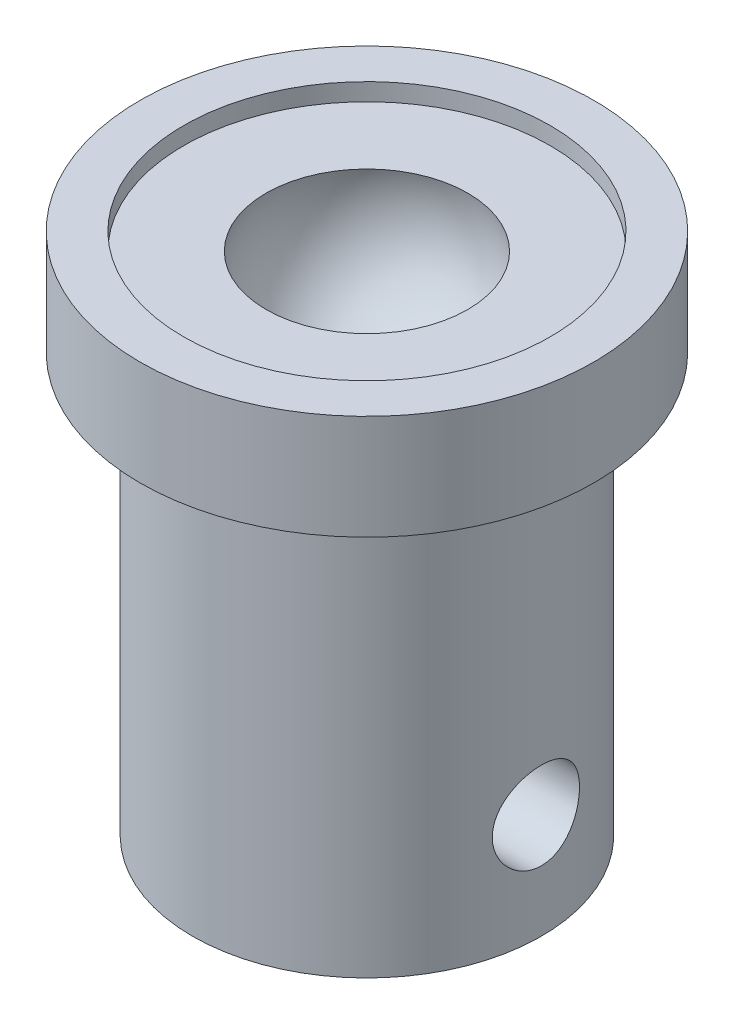
ISO-10303-21;
HEADER;
FILE_DESCRIPTION(('STEP AP214'),'2;1');
FILE_NAME('part.step','',(''),(''),'','','');
FILE_SCHEMA(('AUTOMOTIVE_DESIGN { 1 0 10303 214 1 1 1 1 }'));
ENDSEC;
DATA;
#1=APPLICATION_CONTEXT('core data for automotive mechanical design processes');
#2=APPLICATION_PROTOCOL_DEFINITION('international standard','automotive_design',2000,#1);
#3=PRODUCT_CONTEXT('',#1,'mechanical');
#4=PRODUCT('Part','Part','',(#3));
#5=PRODUCT_RELATED_PRODUCT_CATEGORY('part','',(#4));
#6=PRODUCT_DEFINITION_FORMATION('','',#4);
#7=PRODUCT_DEFINITION_CONTEXT('part definition',#1,'design');
#8=PRODUCT_DEFINITION('design','',#6,#7);
#9=PRODUCT_DEFINITION_SHAPE('','',#8);
#10=(LENGTH_UNIT() NAMED_UNIT(*) SI_UNIT(.MILLI.,.METRE.));
#11=(NAMED_UNIT(*) PLANE_ANGLE_UNIT() SI_UNIT($,.RADIAN.));
#12=(NAMED_UNIT(*) SI_UNIT($,.STERADIAN.) SOLID_ANGLE_UNIT());
#13=UNCERTAINTY_MEASURE_WITH_UNIT(LENGTH_MEASURE(1.E-05),#10,'distance_accuracy_value','');
#14=(GEOMETRIC_REPRESENTATION_CONTEXT(3) GLOBAL_UNCERTAINTY_ASSIGNED_CONTEXT((#13)) GLOBAL_UNIT_ASSIGNED_CONTEXT((#10,
#11,#12)) REPRESENTATION_CONTEXT('',''));
#15=CARTESIAN_POINT('',(0.,0.,0.));
#16=DIRECTION('',(0.,0.,1.));
#17=DIRECTION('',(1.,0.,0.));
#18=AXIS2_PLACEMENT_3D('',#15,#16,#17);
#19=CARTESIAN_POINT('',(-13.,6.,0.));
#20=DIRECTION('',(1.,0.,0.));
#21=DIRECTION('',(0.,0.,-1.));
#22=AXIS2_PLACEMENT_3D('',#19,#20,#21);
#23=CYLINDRICAL_SURFACE('',#22,2.5);
#24=CARTESIAN_POINT('',(-4.5,6.,0.));
#25=DIRECTION('',(-1.,0.,0.));
#26=DIRECTION('',(0.,0.,1.));
#27=AXIS2_PLACEMENT_3D('',#24,#25,#26);
#28=CIRCLE('',#27,2.5);
#29=CARTESIAN_POINT('',(-4.5,6.,2.5));
#30=VERTEX_POINT('',#29);
#31=EDGE_CURVE('E134',#30,#30,#28,.F.);
#32=ORIENTED_EDGE('',*,*,#31,.T.);
#33=EDGE_LOOP('',(#32));
#34=FACE_BOUND('',#33,.T.);
#35=CARTESIAN_POINT('',(-9.68245836551854,6.,-2.5));
#36=CARTESIAN_POINT('',(-9.6824610008786,6.13805075092658,-2.49999607859307));
#37=CARTESIAN_POINT('',(-9.68544306014597,6.27614489867852,-2.48852624549765));
#38=CARTESIAN_POINT('',(-9.69701861992564,6.54836757817351,-2.44302312546379));
#39=CARTESIAN_POINT('',(-9.7056153862163,6.68249375446819,-2.40897670674211));
#40=CARTESIAN_POINT('',(-9.7273872459615,6.94280353818718,-2.31949119963204));
#41=CARTESIAN_POINT('',(-9.74055642690458,7.06899715538571,-2.26407972785449));
#42=CARTESIAN_POINT('',(-9.76998192028759,7.31031085253988,-2.13352114126138));
#43=CARTESIAN_POINT('',(-9.78623836378489,7.42543046208022,-2.05837318856068));
#44=CARTESIAN_POINT('',(-9.82040716355625,7.64386164526222,-1.88870842731188));
#45=CARTESIAN_POINT('',(-9.83834597623034,7.74689360035005,-1.79383688770405));
#46=CARTESIAN_POINT('',(-9.87362875515294,7.93576139436034,-1.58818206410066));
#47=CARTESIAN_POINT('',(-9.89097266566388,8.02159562562175,-1.47739729418031));
#48=CARTESIAN_POINT('',(-9.92340415520583,8.17477546763128,-1.24114520107895));
#49=CARTESIAN_POINT('',(-9.93845687400592,8.24184638816147,-1.11549457619512));
#50=CARTESIAN_POINT('',(-9.96430811925984,8.35380964415308,-0.85426318429276));
#51=CARTESIAN_POINT('',(-9.97510727334345,8.39870525191552,-0.718683885791939));
#52=CARTESIAN_POINT('',(-9.9910475884818,8.46414783457859,-0.44435875875416));
#53=CARTESIAN_POINT('',(-9.99629893844314,8.48516964432658,-0.305732719548974));
#54=CARTESIAN_POINT('',(-10.000935941073,8.50375837927555,-0.026828819262768));
#55=CARTESIAN_POINT('',(-10.000322460967,8.5013287722096,0.11344879453807));
#56=CARTESIAN_POINT('',(-9.99338094953534,8.47342514974986,0.38838061793097));
#57=CARTESIAN_POINT('',(-9.98718002340871,8.44846367494614,0.523090539002669));
#58=CARTESIAN_POINT('',(-9.96990836524857,8.3770287299515,0.786345618534217));
#59=CARTESIAN_POINT('',(-9.95883737398452,8.33055411462259,0.914890448426096));
#60=CARTESIAN_POINT('',(-9.93287509700884,8.21699742931294,1.16351675875452));
#61=CARTESIAN_POINT('',(-9.91795019695011,8.14973295533825,1.28351127441626));
#62=CARTESIAN_POINT('',(-9.88589903809692,7.99664432088374,1.51068905585122));
#63=CARTESIAN_POINT('',(-9.8687723965265,7.91081693143937,1.61787008771377));
#64=CARTESIAN_POINT('',(-9.83363713769356,7.72029125801763,1.81943508771239));
#65=CARTESIAN_POINT('',(-9.81561719525297,7.61514510765225,1.91339419768799));
#66=CARTESIAN_POINT('',(-9.78115043517327,7.39040002645972,2.08244093990755));
#67=CARTESIAN_POINT('',(-9.76470369108289,7.27080042050889,2.15752769011507));
#68=CARTESIAN_POINT('',(-9.73520496829319,7.01970996585114,2.28697032255647));
#69=CARTESIAN_POINT('',(-9.72216983717007,6.88816426968719,2.34122391742613));
#70=CARTESIAN_POINT('',(-9.70118640148669,6.61741453192316,2.42671405159096));
#71=CARTESIAN_POINT('',(-9.69323700842733,6.4782121360154,2.45795551638266));
#72=CARTESIAN_POINT('',(-9.68355356007457,6.20004049847008,2.49582963866592));
#73=CARTESIAN_POINT('',(-9.68166088976933,6.06116220665897,2.50309047391912));
#74=CARTESIAN_POINT('',(-9.68387343364692,5.78417806341474,2.49451699051516));
#75=CARTESIAN_POINT('',(-9.687978095703,5.64607214205056,2.4786847978498));
#76=CARTESIAN_POINT('',(-9.7015708198498,5.37688573505143,2.42492546393825));
#77=CARTESIAN_POINT('',(-9.71096970242532,5.2457272734308,2.3873640682819));
#78=CARTESIAN_POINT('',(-9.73400718262805,4.99156854214667,2.29161808167046));
#79=CARTESIAN_POINT('',(-9.74764628246408,4.86856924094421,2.2334310477125));
#80=CARTESIAN_POINT('',(-9.77796137095511,4.6315587221331,2.0967706679366));
#81=CARTESIAN_POINT('',(-9.79469168607245,4.51777115995702,2.01792175383564));
#82=CARTESIAN_POINT('',(-9.82917083071113,4.30481163719852,1.84265073233613));
#83=CARTESIAN_POINT('',(-9.84691982728307,4.20564208334989,1.74622573701359));
#84=CARTESIAN_POINT('',(-9.88197403031774,4.02218895742908,1.53565680246182));
#85=CARTESIAN_POINT('',(-9.8992570206188,3.9383399374512,1.42112988132898));
#86=CARTESIAN_POINT('',(-9.93097216613689,3.79106413304875,1.17925670673669));
#87=CARTESIAN_POINT('',(-9.94540447003949,3.72763628339179,1.05191112239398));
#88=CARTESIAN_POINT('',(-9.96970115738325,3.62355396547207,0.788895504327724));
#89=CARTESIAN_POINT('',(-9.97959830022409,3.58273571562093,0.653293452569703));
#90=CARTESIAN_POINT('',(-9.99385293395789,3.52453966539158,0.376874400797015));
#91=CARTESIAN_POINT('',(-9.99821149393422,3.50715734126096,0.236058412603099));
#92=CARTESIAN_POINT('',(-10.0008542352202,3.49658102606115,-0.0427088161083106));
#93=CARTESIAN_POINT('',(-9.99929947199971,3.50274572726148,-0.180634567415057));
#94=CARTESIAN_POINT('',(-9.99064741143608,3.53761956823587,-0.45341874103688));
#95=CARTESIAN_POINT('',(-9.98355027892922,3.56632803753292,-0.588277254452324));
#96=CARTESIAN_POINT('',(-9.96463582134723,3.64513054942715,-0.850427589111938));
#97=CARTESIAN_POINT('',(-9.95284411255981,3.69510863328595,-0.977756236452159));
#98=CARTESIAN_POINT('',(-9.92578222284145,3.81492644754893,-1.22229263260406));
#99=CARTESIAN_POINT('',(-9.91051160346894,3.88476868167621,-1.33949910316409));
#100=CARTESIAN_POINT('',(-9.87768124200718,4.04428808499033,-1.56350482105826));
#101=CARTESIAN_POINT('',(-9.86007542354161,4.13440035725958,-1.66998747074584));
#102=CARTESIAN_POINT('',(-9.82476622642974,4.33105712994337,-1.86653755068376));
#103=CARTESIAN_POINT('',(-9.80706282418256,4.43760579027791,-1.95660081269148));
#104=CARTESIAN_POINT('',(-9.77318689613756,4.66650353547365,-2.11940506617958));
#105=CARTESIAN_POINT('',(-9.75704909183222,4.78911030841314,-2.19179154854095));
#106=CARTESIAN_POINT('',(-9.7285988873707,5.04513872468705,-2.31481724146368));
#107=CARTESIAN_POINT('',(-9.71628370583034,5.17855241523462,-2.36547227438038));
#108=CARTESIAN_POINT('',(-9.69879771876843,5.4264425295879,-2.43605632142751));
#109=CARTESIAN_POINT('',(-9.69271657508747,5.53973291096534,-2.4599829264922));
#110=CARTESIAN_POINT('',(-9.6845459645655,5.76867217249422,-2.49195573142942));
#111=CARTESIAN_POINT('',(-9.68245615722769,5.88432085061101,-2.50000328592938));
#112=CARTESIAN_POINT('',(-9.68245836551854,6.,-2.5));
#113=B_SPLINE_CURVE_WITH_KNOTS('',3,(#35,#36,#37,#38,#39,#40,#41,#42,#43,#44,#45,#46,#47,#48,
#49,#50,#51,#52,#53,#54,#55,#56,#57,#58,#59,#60,#61,#62,#63,#64,#65,#66,#67,#68,#69,#70,#71,#72,
#73,#74,#75,#76,#77,#78,#79,#80,#81,#82,#83,#84,#85,#86,#87,#88,#89,#90,#91,#92,#93,#94,#95,#96,
#97,#98,#99,#100,#101,#102,#103,#104,#105,#106,#107,#108,#109,#110,#111,#112),.UNSPECIFIED.,.T.,
.F.,(4,2,2,2,2,2,2,2,2,2,2,2,2,2,2,2,2,2,2,2,2,2,2,2,2,2,2,2,2,2,2,2,2,2,2,2,2,2,4),(0.,
0.413727441736137,0.827695741428667,1.24113072716602,1.65458326755479,2.07623954192976,
2.49793521479867,2.9255149639792,3.35303159847092,3.77188750995347,4.19068148666021,
4.60018262688947,5.00970556724786,5.42292874254445,5.83622385468913,6.26070466571912,
6.68520531199802,7.11176432008403,7.53823200129548,7.95343574764204,8.36860127188747,
8.77697405014152,9.18539521426363,9.60182845864102,10.0183301888999,10.4452533097026,
10.872154157245,11.2959207281187,11.7196054891398,12.131834461324,12.5440511738193,
12.9540487656466,13.3640980574302,13.7839709658702,14.2039503157045,14.6317647729113,
15.0592672137502,15.4059782718573,15.7526597510792),.UNSPECIFIED.);
#114=CARTESIAN_POINT('',(-9.68245836551854,6.,-2.5));
#115=VERTEX_POINT('',#114);
#116=EDGE_CURVE('E125',#115,#115,#113,.T.);
#117=ORIENTED_EDGE('',*,*,#116,.F.);
#118=EDGE_LOOP('',(#117));
#119=FACE_BOUND('',#118,.T.);
#120=ADVANCED_FACE('F35',(#34,#119),#23,.F.);
#121=CARTESIAN_POINT('',(0.,30.,0.));
#122=DIRECTION('',(0.,-1.,0.));
#123=DIRECTION('',(0.,0.,-1.));
#124=AXIS2_PLACEMENT_3D('',#121,#122,#123);
#125=CYLINDRICAL_SURFACE('',#124,10.);
#126=ORIENTED_EDGE('',*,*,#116,.T.);
#127=EDGE_LOOP('',(#126));
#128=FACE_BOUND('',#127,.T.);
#129=CARTESIAN_POINT('',(9.68245836551854,6.,-2.5));
#130=CARTESIAN_POINT('',(9.6824610008786,5.86194924907342,-2.49999607859307));
#131=CARTESIAN_POINT('',(9.68544306014597,5.72385510132148,-2.48852624549765));
#132=CARTESIAN_POINT('',(9.69701861992564,5.45163242182649,-2.44302312546379));
#133=CARTESIAN_POINT('',(9.7056153862163,5.31750624553181,-2.40897670674211));
#134=CARTESIAN_POINT('',(9.7273872459615,5.05719646181282,-2.31949119963204));
#135=CARTESIAN_POINT('',(9.74055642690458,4.93100284461429,-2.26407972785449));
#136=CARTESIAN_POINT('',(9.76998192028759,4.68968914746012,-2.13352114126138));
#137=CARTESIAN_POINT('',(9.78623836378489,4.57456953791978,-2.05837318856068));
#138=CARTESIAN_POINT('',(9.82040716355625,4.35613835473778,-1.88870842731188));
#139=CARTESIAN_POINT('',(9.83834597623034,4.25310639964995,-1.79383688770405));
#140=CARTESIAN_POINT('',(9.87362875515294,4.06423860563966,-1.58818206410066));
#141=CARTESIAN_POINT('',(9.89097266566388,3.97840437437825,-1.47739729418031));
#142=CARTESIAN_POINT('',(9.92340415520582,3.82522453236872,-1.24114520107895));
#143=CARTESIAN_POINT('',(9.93845687400592,3.75815361183853,-1.11549457619512));
#144=CARTESIAN_POINT('',(9.96430811925984,3.64619035584692,-0.854263184292761));
#145=CARTESIAN_POINT('',(9.97510727334345,3.60129474808448,-0.718683885791939));
#146=CARTESIAN_POINT('',(9.9910475884818,3.53585216542141,-0.44435875875416));
#147=CARTESIAN_POINT('',(9.99629893844314,3.51483035567342,-0.305732719548974));
#148=CARTESIAN_POINT('',(10.000935941073,3.49624162072445,-0.026828819262768));
#149=CARTESIAN_POINT('',(10.000322460967,3.4986712277904,0.11344879453807));
#150=CARTESIAN_POINT('',(9.99338094953534,3.52657485025014,0.388380617930969));
#151=CARTESIAN_POINT('',(9.98718002340871,3.55153632505386,0.523090539002669));
#152=CARTESIAN_POINT('',(9.96990836524857,3.6229712700485,0.786345618534217));
#153=CARTESIAN_POINT('',(9.95883737398452,3.66944588537741,0.914890448426096));
#154=CARTESIAN_POINT('',(9.93287509700884,3.78300257068706,1.16351675875452));
#155=CARTESIAN_POINT('',(9.91795019695011,3.85026704466174,1.28351127441626));
#156=CARTESIAN_POINT('',(9.88589903809692,4.00335567911626,1.51068905585122));
#157=CARTESIAN_POINT('',(9.8687723965265,4.08918306856063,1.61787008771377));
#158=CARTESIAN_POINT('',(9.83363713769356,4.27970874198237,1.81943508771239));
#159=CARTESIAN_POINT('',(9.81561719525297,4.38485489234775,1.91339419768799));
#160=CARTESIAN_POINT('',(9.78115043517327,4.60959997354028,2.08244093990755));
#161=CARTESIAN_POINT('',(9.76470369108289,4.72919957949111,2.15752769011507));
#162=CARTESIAN_POINT('',(9.73520496829319,4.98029003414886,2.28697032255647));
#163=CARTESIAN_POINT('',(9.72216983717007,5.1118357303128,2.34122391742613));
#164=CARTESIAN_POINT('',(9.70118640148669,5.38258546807684,2.42671405159095));
#165=CARTESIAN_POINT('',(9.69323700842733,5.5217878639846,2.45795551638266));
#166=CARTESIAN_POINT('',(9.68355356007457,5.79995950152992,2.49582963866592));
#167=CARTESIAN_POINT('',(9.68166088976933,5.93883779334103,2.50309047391912));
#168=CARTESIAN_POINT('',(9.68387343364692,6.21582193658526,2.49451699051516));
#169=CARTESIAN_POINT('',(9.687978095703,6.35392785794944,2.4786847978498));
#170=CARTESIAN_POINT('',(9.70157081984979,6.62311426494857,2.42492546393825));
#171=CARTESIAN_POINT('',(9.71096970242531,6.7542727265692,2.3873640682819));
#172=CARTESIAN_POINT('',(9.73400718262805,7.00843145785333,2.29161808167046));
#173=CARTESIAN_POINT('',(9.74764628246408,7.13143075905578,2.2334310477125));
#174=CARTESIAN_POINT('',(9.77796137095511,7.3684412778669,2.0967706679366));
#175=CARTESIAN_POINT('',(9.79469168607245,7.48222884004298,2.01792175383564));
#176=CARTESIAN_POINT('',(9.82917083071113,7.69518836280148,1.84265073233613));
#177=CARTESIAN_POINT('',(9.84691982728307,7.79435791665011,1.7462257370136));
#178=CARTESIAN_POINT('',(9.88197403031774,7.97781104257092,1.53565680246182));
#179=CARTESIAN_POINT('',(9.8992570206188,8.06166006254881,1.42112988132898));
#180=CARTESIAN_POINT('',(9.93097216613689,8.20893586695125,1.17925670673669));
#181=CARTESIAN_POINT('',(9.94540447003949,8.27236371660821,1.05191112239398));
#182=CARTESIAN_POINT('',(9.96970115738325,8.37644603452793,0.788895504327727));
#183=CARTESIAN_POINT('',(9.97959830022409,8.41726428437907,0.653293452569706));
#184=CARTESIAN_POINT('',(9.99385293395789,8.47546033460842,0.376874400797018));
#185=CARTESIAN_POINT('',(9.99821149393422,8.49284265873904,0.236058412603101));
#186=CARTESIAN_POINT('',(10.0008542352202,8.50341897393885,-0.0427088161083087));
#187=CARTESIAN_POINT('',(9.99929947199971,8.49725427273852,-0.180634567415055));
#188=CARTESIAN_POINT('',(9.99064741143608,8.46238043176413,-0.453418741036878));
#189=CARTESIAN_POINT('',(9.98355027892922,8.43367196246708,-0.588277254452323));
#190=CARTESIAN_POINT('',(9.96463582134723,8.35486945057285,-0.850427589111936));
#191=CARTESIAN_POINT('',(9.95284411255981,8.30489136671405,-0.977756236452157));
#192=CARTESIAN_POINT('',(9.92578222284145,8.18507355245107,-1.22229263260406));
#193=CARTESIAN_POINT('',(9.91051160346894,8.11523131832379,-1.33949910316408));
#194=CARTESIAN_POINT('',(9.87768124200718,7.95571191500967,-1.56350482105826));
#195=CARTESIAN_POINT('',(9.86007542354161,7.86559964274043,-1.66998747074584));
#196=CARTESIAN_POINT('',(9.82476622642974,7.66894287005663,-1.86653755068376));
#197=CARTESIAN_POINT('',(9.80706282418256,7.56239420972209,-1.95660081269148));
#198=CARTESIAN_POINT('',(9.77318689613756,7.33349646452635,-2.11940506617958));
#199=CARTESIAN_POINT('',(9.75704909183222,7.21088969158687,-2.19179154854095));
#200=CARTESIAN_POINT('',(9.7285988873707,6.95486127531295,-2.31481724146367));
#201=CARTESIAN_POINT('',(9.71628370583034,6.82144758476538,-2.36547227438038));
#202=CARTESIAN_POINT('',(9.69879771876843,6.5735574704121,-2.43605632142751));
#203=CARTESIAN_POINT('',(9.69271657508747,6.46026708903466,-2.4599829264922));
#204=CARTESIAN_POINT('',(9.6845459645655,6.23132782750578,-2.49195573142942));
#205=CARTESIAN_POINT('',(9.68245615722769,6.11567914938899,-2.50000328592938));
#206=CARTESIAN_POINT('',(9.68245836551854,6.,-2.5));
#207=B_SPLINE_CURVE_WITH_KNOTS('',3,(#129,#130,#131,#132,#133,#134,#135,#136,#137,#138,#139,
#140,#141,#142,#143,#144,#145,#146,#147,#148,#149,#150,#151,#152,#153,#154,#155,#156,#157,#158,
#159,#160,#161,#162,#163,#164,#165,#166,#167,#168,#169,#170,#171,#172,#173,#174,#175,#176,#177,
#178,#179,#180,#181,#182,#183,#184,#185,#186,#187,#188,#189,#190,#191,#192,#193,#194,#195,#196,
#197,#198,#199,#200,#201,#202,#203,#204,#205,#206),.UNSPECIFIED.,.T.,.F.,(4,2,2,2,2,2,2,2,2,2,2,
2,2,2,2,2,2,2,2,2,2,2,2,2,2,2,2,2,2,2,2,2,2,2,2,2,2,2,4),(0.,0.413727441736137,
0.827695741428667,1.24113072716602,1.65458326755479,2.07623954192976,2.49793521479867,
2.9255149639792,3.35303159847093,3.77188750995347,4.19068148666021,4.60018262688947,
5.00970556724786,5.42292874254445,5.83622385468914,6.26070466571912,6.68520531199802,
7.11176432008403,7.53823200129548,7.95343574764205,8.36860127188747,8.77697405014152,
9.18539521426363,9.60182845864103,10.0183301888999,10.4452533097026,10.872154157245,
11.2959207281187,11.7196054891398,12.131834461324,12.5440511738193,12.9540487656466,
13.3640980574302,13.7839709658702,14.2039503157045,14.6317647729113,15.0592672137501,
15.4059782718573,15.7526597510792),.UNSPECIFIED.);
#208=CARTESIAN_POINT('',(9.68245836551854,6.,-2.5));
#209=VERTEX_POINT('',#208);
#210=EDGE_CURVE('E128',#209,#209,#207,.T.);
#211=ORIENTED_EDGE('',*,*,#210,.T.);
#212=EDGE_LOOP('',(#211));
#213=FACE_BOUND('',#212,.T.);
#214=CARTESIAN_POINT('',(0.,0.,0.));
#215=DIRECTION('',(0.,1.,0.));
#216=DIRECTION('',(0.,0.,1.));
#217=AXIS2_PLACEMENT_3D('',#214,#215,#216);
#218=CIRCLE('',#217,10.);
#219=CARTESIAN_POINT('',(0.,0.,10.));
#220=VERTEX_POINT('',#219);
#221=EDGE_CURVE('E45',#220,#220,#218,.T.);
#222=ORIENTED_EDGE('',*,*,#221,.T.);
#223=EDGE_LOOP('',(#222));
#224=FACE_BOUND('',#223,.T.);
#225=CARTESIAN_POINT('',(0.,24.,0.));
#226=DIRECTION('',(0.,1.,0.));
#227=DIRECTION('',(0.,0.,1.));
#228=AXIS2_PLACEMENT_3D('',#225,#226,#227);
#229=CIRCLE('',#228,10.);
#230=CARTESIAN_POINT('',(0.,24.,10.));
#231=VERTEX_POINT('',#230);
#232=EDGE_CURVE('E11',#231,#231,#229,.T.);
#233=ORIENTED_EDGE('',*,*,#232,.F.);
#234=EDGE_LOOP('',(#233));
#235=FACE_BOUND('',#234,.T.);
#236=ADVANCED_FACE('F37',(#128,#213,#224,#235),#125,.T.);
#237=CARTESIAN_POINT('',(0.,0.,0.));
#238=DIRECTION('',(0.,1.,0.));
#239=DIRECTION('',(0.,0.,1.));
#240=AXIS2_PLACEMENT_3D('',#237,#238,#239);
#241=PLANE('',#240);
#242=DIRECTION('',(1.,0.,0.));
#243=VECTOR('',#242,1.);
#244=CARTESIAN_POINT('',(4.5,0.,-4.5));
#245=LINE('',#244,#243);
#246=CARTESIAN_POINT('',(-4.5,0.,-4.5));
#247=VERTEX_POINT('',#246);
#248=CARTESIAN_POINT('',(4.5,0.,-4.5));
#249=VERTEX_POINT('',#248);
#250=EDGE_CURVE('E88',#247,#249,#245,.T.);
#251=ORIENTED_EDGE('',*,*,#250,.F.);
#252=DIRECTION('',(0.,0.,-1.));
#253=VECTOR('',#252,1.);
#254=CARTESIAN_POINT('',(-4.5,0.,4.5));
#255=LINE('',#254,#253);
#256=CARTESIAN_POINT('',(-4.5,0.,4.5));
#257=VERTEX_POINT('',#256);
#258=EDGE_CURVE('E53',#257,#247,#255,.T.);
#259=ORIENTED_EDGE('',*,*,#258,.F.);
#260=DIRECTION('',(-1.,0.,0.));
#261=VECTOR('',#260,1.);
#262=CARTESIAN_POINT('',(4.5,0.,4.5));
#263=LINE('',#262,#261);
#264=CARTESIAN_POINT('',(4.5,0.,4.5));
#265=VERTEX_POINT('',#264);
#266=EDGE_CURVE('E105',#265,#257,#263,.T.);
#267=ORIENTED_EDGE('',*,*,#266,.F.);
#268=DIRECTION('',(0.,0.,1.));
#269=VECTOR('',#268,1.);
#270=CARTESIAN_POINT('',(4.5,0.,4.5));
#271=LINE('',#270,#269);
#272=EDGE_CURVE('E112',#249,#265,#271,.T.);
#273=ORIENTED_EDGE('',*,*,#272,.F.);
#274=EDGE_LOOP('',(#251,#259,#267,#273));
#275=FACE_BOUND('',#274,.T.);
#276=ORIENTED_EDGE('',*,*,#221,.F.);
#277=EDGE_LOOP('',(#276));
#278=FACE_BOUND('',#277,.T.);
#279=ADVANCED_FACE('F155',(#275,#278),#241,.F.);
#280=CARTESIAN_POINT('',(0.,24.,0.));
#281=DIRECTION('',(0.,1.,0.));
#282=DIRECTION('',(0.,0.,1.));
#283=AXIS2_PLACEMENT_3D('',#280,#281,#282);
#284=CYLINDRICAL_SURFACE('',#283,13.);
#285=CARTESIAN_POINT('',(0.,24.,0.));
#286=DIRECTION('',(0.,1.,0.));
#287=DIRECTION('',(0.,0.,1.));
#288=AXIS2_PLACEMENT_3D('',#285,#286,#287);
#289=CIRCLE('',#288,13.);
#290=CARTESIAN_POINT('',(0.,24.,13.));
#291=VERTEX_POINT('',#290);
#292=EDGE_CURVE('E119',#291,#291,#289,.T.);
#293=ORIENTED_EDGE('',*,*,#292,.T.);
#294=EDGE_LOOP('',(#293));
#295=FACE_BOUND('',#294,.T.);
#296=CARTESIAN_POINT('',(0.,30.,0.));
#297=DIRECTION('',(0.,1.,0.));
#298=DIRECTION('',(0.,0.,1.));
#299=AXIS2_PLACEMENT_3D('',#296,#297,#298);
#300=CIRCLE('',#299,13.);
#301=CARTESIAN_POINT('',(0.,30.,13.));
#302=VERTEX_POINT('',#301);
#303=EDGE_CURVE('E122',#302,#302,#300,.T.);
#304=ORIENTED_EDGE('',*,*,#303,.F.);
#305=EDGE_LOOP('',(#304));
#306=FACE_BOUND('',#305,.T.);
#307=ADVANCED_FACE('F151',(#295,#306),#284,.T.);
#308=CARTESIAN_POINT('',(0.,24.,0.));
#309=DIRECTION('',(0.,1.,0.));
#310=DIRECTION('',(0.,0.,1.));
#311=AXIS2_PLACEMENT_3D('',#308,#309,#310);
#312=PLANE('',#311);
#313=ORIENTED_EDGE('',*,*,#232,.T.);
#314=EDGE_LOOP('',(#313));
#315=FACE_BOUND('',#314,.T.);
#316=ORIENTED_EDGE('',*,*,#292,.F.);
#317=EDGE_LOOP('',(#316));
#318=FACE_BOUND('',#317,.T.);
#319=ADVANCED_FACE('F147',(#315,#318),#312,.F.);
#320=CARTESIAN_POINT('',(0.,30.,0.));
#321=DIRECTION('',(0.,1.,0.));
#322=DIRECTION('',(0.,0.,1.));
#323=AXIS2_PLACEMENT_3D('',#320,#321,#322);
#324=PLANE('',#323);
#325=CARTESIAN_POINT('',(0.,30.,0.));
#326=DIRECTION('',(0.,1.,0.));
#327=DIRECTION('',(0.,0.,1.));
#328=AXIS2_PLACEMENT_3D('',#325,#326,#327);
#329=CIRCLE('',#328,10.5);
#330=CARTESIAN_POINT('',(0.,30.,10.5));
#331=VERTEX_POINT('',#330);
#332=EDGE_CURVE('E225',#331,#331,#329,.T.);
#333=ORIENTED_EDGE('',*,*,#332,.F.);
#334=EDGE_LOOP('',(#333));
#335=FACE_BOUND('',#334,.T.);
#336=ORIENTED_EDGE('',*,*,#303,.T.);
#337=EDGE_LOOP('',(#336));
#338=FACE_BOUND('',#337,.T.);
#339=ADVANCED_FACE('F144',(#335,#338),#324,.T.);
#340=CARTESIAN_POINT('',(4.5,6.,0.));
#341=DIRECTION('',(1.,0.,0.));
#342=DIRECTION('',(0.,0.,-1.));
#343=AXIS2_PLACEMENT_3D('',#340,#341,#342);
#344=CIRCLE('',#343,2.5);
#345=CARTESIAN_POINT('',(4.5,6.,-2.5));
#346=VERTEX_POINT('',#345);
#347=EDGE_CURVE('E116',#346,#346,#344,.F.);
#348=ORIENTED_EDGE('',*,*,#347,.T.);
#349=EDGE_LOOP('',(#348));
#350=FACE_BOUND('',#349,.T.);
#351=ORIENTED_EDGE('',*,*,#210,.F.);
#352=EDGE_LOOP('',(#351));
#353=FACE_BOUND('',#352,.T.);
#354=ADVANCED_FACE('F138',(#350,#353),#23,.F.);
#355=CARTESIAN_POINT('',(-4.5,15.,4.5));
#356=DIRECTION('',(-1.,0.,0.));
#357=DIRECTION('',(0.,0.,1.));
#358=AXIS2_PLACEMENT_3D('',#355,#356,#357);
#359=PLANE('',#358);
#360=ORIENTED_EDGE('',*,*,#258,.T.);
#361=DIRECTION('',(0.,-1.,0.));
#362=VECTOR('',#361,1.);
#363=CARTESIAN_POINT('',(-4.5,15.,-4.5));
#364=LINE('',#363,#362);
#365=CARTESIAN_POINT('',(-4.5,15.,-4.5));
#366=VERTEX_POINT('',#365);
#367=EDGE_CURVE('E76',#366,#247,#364,.T.);
#368=ORIENTED_EDGE('',*,*,#367,.F.);
#369=DIRECTION('',(0.,0.,-1.));
#370=VECTOR('',#369,1.);
#371=CARTESIAN_POINT('',(-4.5,15.,4.5));
#372=LINE('',#371,#370);
#373=CARTESIAN_POINT('',(-4.5,15.,4.5));
#374=VERTEX_POINT('',#373);
#375=EDGE_CURVE('E103',#374,#366,#372,.T.);
#376=ORIENTED_EDGE('',*,*,#375,.F.);
#377=DIRECTION('',(0.,-1.,0.));
#378=VECTOR('',#377,1.);
#379=CARTESIAN_POINT('',(-4.5,15.,4.5));
#380=LINE('',#379,#378);
#381=EDGE_CURVE('E61',#374,#257,#380,.T.);
#382=ORIENTED_EDGE('',*,*,#381,.T.);
#383=EDGE_LOOP('',(#360,#368,#376,#382));
#384=FACE_BOUND('',#383,.T.);
#385=ORIENTED_EDGE('',*,*,#31,.F.);
#386=EDGE_LOOP('',(#385));
#387=FACE_BOUND('',#386,.T.);
#388=ADVANCED_FACE('F143',(#384,#387),#359,.F.);
#389=CARTESIAN_POINT('',(4.5,15.,4.5));
#390=DIRECTION('',(1.,0.,0.));
#391=DIRECTION('',(0.,0.,-1.));
#392=AXIS2_PLACEMENT_3D('',#389,#390,#391);
#393=PLANE('',#392);
#394=ORIENTED_EDGE('',*,*,#272,.T.);
#395=DIRECTION('',(0.,-1.,0.));
#396=VECTOR('',#395,1.);
#397=CARTESIAN_POINT('',(4.5,15.,4.5));
#398=LINE('',#397,#396);
#399=CARTESIAN_POINT('',(4.5,15.,4.5));
#400=VERTEX_POINT('',#399);
#401=EDGE_CURVE('E92',#400,#265,#398,.T.);
#402=ORIENTED_EDGE('',*,*,#401,.F.);
#403=DIRECTION('',(0.,0.,1.));
#404=VECTOR('',#403,1.);
#405=CARTESIAN_POINT('',(4.5,15.,4.5));
#406=LINE('',#405,#404);
#407=CARTESIAN_POINT('',(4.5,15.,-4.5));
#408=VERTEX_POINT('',#407);
#409=EDGE_CURVE('E95',#408,#400,#406,.T.);
#410=ORIENTED_EDGE('',*,*,#409,.F.);
#411=DIRECTION('',(0.,-1.,0.));
#412=VECTOR('',#411,1.);
#413=CARTESIAN_POINT('',(4.5,15.,-4.5));
#414=LINE('',#413,#412);
#415=EDGE_CURVE('E81',#408,#249,#414,.T.);
#416=ORIENTED_EDGE('',*,*,#415,.T.);
#417=EDGE_LOOP('',(#394,#402,#410,#416));
#418=FACE_BOUND('',#417,.T.);
#419=ORIENTED_EDGE('',*,*,#347,.F.);
#420=EDGE_LOOP('',(#419));
#421=FACE_BOUND('',#420,.T.);
#422=ADVANCED_FACE('F96',(#418,#421),#393,.F.);
#423=CARTESIAN_POINT('',(4.5,15.,4.5));
#424=DIRECTION('',(0.,0.,1.));
#425=DIRECTION('',(1.,0.,0.));
#426=AXIS2_PLACEMENT_3D('',#423,#424,#425);
#427=PLANE('',#426);
#428=ORIENTED_EDGE('',*,*,#266,.T.);
#429=ORIENTED_EDGE('',*,*,#381,.F.);
#430=DIRECTION('',(-1.,0.,0.));
#431=VECTOR('',#430,1.);
#432=CARTESIAN_POINT('',(4.5,15.,4.5));
#433=LINE('',#432,#431);
#434=EDGE_CURVE('E100',#400,#374,#433,.T.);
#435=ORIENTED_EDGE('',*,*,#434,.F.);
#436=ORIENTED_EDGE('',*,*,#401,.T.);
#437=EDGE_LOOP('',(#428,#429,#435,#436));
#438=FACE_BOUND('',#437,.T.);
#439=ADVANCED_FACE('F191',(#438),#427,.F.);
#440=CARTESIAN_POINT('',(4.5,15.,-4.5));
#441=DIRECTION('',(0.,0.,-1.));
#442=DIRECTION('',(-1.,0.,0.));
#443=AXIS2_PLACEMENT_3D('',#440,#441,#442);
#444=PLANE('',#443);
#445=ORIENTED_EDGE('',*,*,#250,.T.);
#446=ORIENTED_EDGE('',*,*,#415,.F.);
#447=DIRECTION('',(1.,0.,0.));
#448=VECTOR('',#447,1.);
#449=CARTESIAN_POINT('',(4.5,15.,-4.5));
#450=LINE('',#449,#448);
#451=EDGE_CURVE('E85',#366,#408,#450,.T.);
#452=ORIENTED_EDGE('',*,*,#451,.F.);
#453=ORIENTED_EDGE('',*,*,#367,.T.);
#454=EDGE_LOOP('',(#445,#446,#452,#453));
#455=FACE_BOUND('',#454,.T.);
#456=ADVANCED_FACE('F83',(#455),#444,.F.);
#457=CARTESIAN_POINT('',(0.,15.,0.));
#458=DIRECTION('',(0.,1.,0.));
#459=DIRECTION('',(0.,0.,1.));
#460=AXIS2_PLACEMENT_3D('',#457,#458,#459);
#461=PLANE('',#460);
#462=ORIENTED_EDGE('',*,*,#375,.T.);
#463=ORIENTED_EDGE('',*,*,#451,.T.);
#464=ORIENTED_EDGE('',*,*,#409,.T.);
#465=ORIENTED_EDGE('',*,*,#434,.T.);
#466=EDGE_LOOP('',(#462,#463,#464,#465));
#467=FACE_BOUND('',#466,.T.);
#468=ADVANCED_FACE('F102',(#467),#461,.F.);
#469=CARTESIAN_POINT('',(0.,29.,0.));
#470=DIRECTION('',(0.,1.,0.));
#471=DIRECTION('',(0.,0.,1.));
#472=AXIS2_PLACEMENT_3D('',#469,#470,#471);
#473=CYLINDRICAL_SURFACE('',#472,10.5);
#474=CARTESIAN_POINT('',(0.,29.,0.));
#475=DIRECTION('',(0.,1.,0.));
#476=DIRECTION('',(0.,0.,1.));
#477=AXIS2_PLACEMENT_3D('',#474,#475,#476);
#478=CIRCLE('',#477,10.5);
#479=CARTESIAN_POINT('',(0.,29.,10.5));
#480=VERTEX_POINT('',#479);
#481=EDGE_CURVE('E224',#480,#480,#478,.T.);
#482=ORIENTED_EDGE('',*,*,#481,.F.);
#483=EDGE_LOOP('',(#482));
#484=FACE_BOUND('',#483,.T.);
#485=ORIENTED_EDGE('',*,*,#332,.T.);
#486=EDGE_LOOP('',(#485));
#487=FACE_BOUND('',#486,.T.);
#488=ADVANCED_FACE('F203',(#484,#487),#473,.F.);
#489=CARTESIAN_POINT('',(0.,29.,0.));
#490=DIRECTION('',(0.,1.,0.));
#491=DIRECTION('',(0.,0.,1.));
#492=AXIS2_PLACEMENT_3D('',#489,#490,#491);
#493=PLANE('',#492);
#494=CARTESIAN_POINT('',(0.,29.,0.));
#495=DIRECTION('',(0.,1.,0.));
#496=DIRECTION('',(0.,0.,1.));
#497=AXIS2_PLACEMENT_3D('',#494,#495,#496);
#498=CIRCLE('',#497,5.78115715079255);
#499=CARTESIAN_POINT('',(0.,29.,5.78115715079255));
#500=VERTEX_POINT('',#499);
#501=EDGE_CURVE('E40',#500,#500,#498,.T.);
#502=ORIENTED_EDGE('',*,*,#501,.F.);
#503=EDGE_LOOP('',(#502));
#504=FACE_BOUND('',#503,.T.);
#505=ORIENTED_EDGE('',*,*,#481,.T.);
#506=EDGE_LOOP('',(#505));
#507=FACE_BOUND('',#506,.T.);
#508=ADVANCED_FACE('F207',(#504,#507),#493,.T.);
#509=CARTESIAN_POINT('',(0.,27.3943157228645,0.));
#510=DIRECTION('',(0.,1.,0.));
#511=DIRECTION('',(1.,0.,0.));
#512=AXIS2_PLACEMENT_3D('',#509,#510,#511);
#513=SPHERICAL_SURFACE('',#512,6.);
#514=ORIENTED_EDGE('',*,*,#501,.T.);
#515=EDGE_LOOP('',(#514));
#516=FACE_BOUND('',#515,.T.);
#517=ADVANCED_FACE('F211',(#516),#513,.F.);
#518=CLOSED_SHELL('',(#120,#236,#279,#307,#319,#339,#354,#388,#422,#439,#456,#468,#488,#508,#517));
#519=MANIFOLD_SOLID_BREP('B2',#518);
#520=ADVANCED_BREP_SHAPE_REPRESENTATION('',(#18,#519),#14);
#521=SHAPE_DEFINITION_REPRESENTATION(#9,#520);
ENDSEC;
END-ISO-10303-21;
